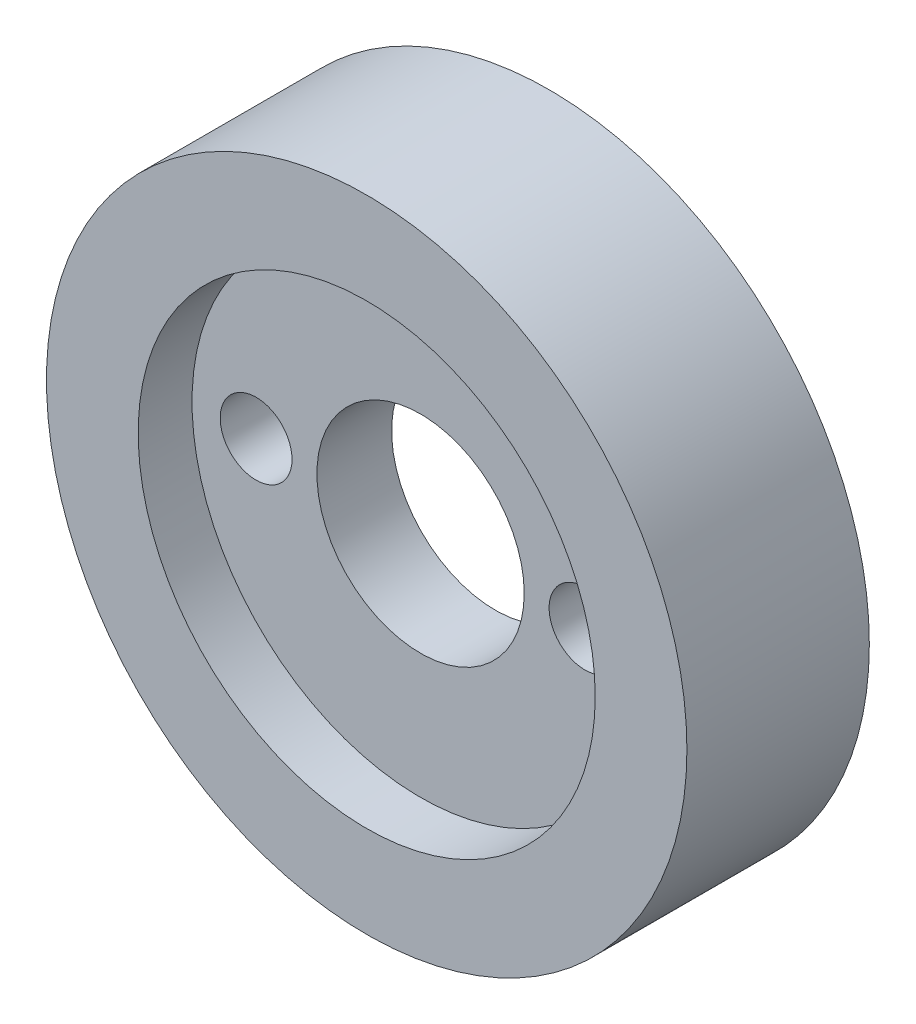
ISO-10303-21;
HEADER;
FILE_DESCRIPTION(('STEP AP214'),'2;1');
FILE_NAME('part.step','',(''),(''),'','','');
FILE_SCHEMA(('AUTOMOTIVE_DESIGN { 1 0 10303 214 1 1 1 1 }'));
ENDSEC;
DATA;
#1=APPLICATION_CONTEXT('core data for automotive mechanical design processes');
#2=APPLICATION_PROTOCOL_DEFINITION('international standard','automotive_design',2000,#1);
#3=PRODUCT_CONTEXT('',#1,'mechanical');
#4=PRODUCT('Part','Part','',(#3));
#5=PRODUCT_RELATED_PRODUCT_CATEGORY('part','',(#4));
#6=PRODUCT_DEFINITION_FORMATION('','',#4);
#7=PRODUCT_DEFINITION_CONTEXT('part definition',#1,'design');
#8=PRODUCT_DEFINITION('design','',#6,#7);
#9=PRODUCT_DEFINITION_SHAPE('','',#8);
#10=(LENGTH_UNIT() NAMED_UNIT(*) SI_UNIT(.MILLI.,.METRE.));
#11=(NAMED_UNIT(*) PLANE_ANGLE_UNIT() SI_UNIT($,.RADIAN.));
#12=(NAMED_UNIT(*) SI_UNIT($,.STERADIAN.) SOLID_ANGLE_UNIT());
#13=UNCERTAINTY_MEASURE_WITH_UNIT(LENGTH_MEASURE(1.E-05),#10,'distance_accuracy_value','');
#14=(GEOMETRIC_REPRESENTATION_CONTEXT(3) GLOBAL_UNCERTAINTY_ASSIGNED_CONTEXT((#13)) GLOBAL_UNIT_ASSIGNED_CONTEXT((#10,
#11,#12)) REPRESENTATION_CONTEXT('',''));
#15=CARTESIAN_POINT('',(0.,0.,0.));
#16=DIRECTION('',(0.,0.,1.));
#17=DIRECTION('',(1.,0.,0.));
#18=AXIS2_PLACEMENT_3D('',#15,#16,#17);
#19=CARTESIAN_POINT('',(0.,0.,2.794));
#20=DIRECTION('',(0.,0.,-1.));
#21=DIRECTION('',(-1.,0.,0.));
#22=AXIS2_PLACEMENT_3D('',#19,#20,#21);
#23=CYLINDRICAL_SURFACE('',#22,3.175);
#24=CARTESIAN_POINT('',(0.,0.,1.144));
#25=DIRECTION('',(0.,0.,1.));
#26=DIRECTION('',(1.,0.,0.));
#27=AXIS2_PLACEMENT_3D('',#24,#25,#26);
#28=CIRCLE('',#27,3.175);
#29=CARTESIAN_POINT('',(3.175,0.,1.144));
#30=VERTEX_POINT('',#29);
#31=EDGE_CURVE('E53',#30,#30,#28,.F.);
#32=ORIENTED_EDGE('',*,*,#31,.F.);
#33=EDGE_LOOP('',(#32));
#34=FACE_BOUND('',#33,.T.);
#35=CARTESIAN_POINT('',(0.,0.,-1.144));
#36=DIRECTION('',(0.,0.,1.));
#37=DIRECTION('',(1.,0.,0.));
#38=AXIS2_PLACEMENT_3D('',#35,#36,#37);
#39=CIRCLE('',#38,3.175);
#40=CARTESIAN_POINT('',(3.175,0.,-1.144));
#41=VERTEX_POINT('',#40);
#42=EDGE_CURVE('E62',#41,#41,#39,.F.);
#43=ORIENTED_EDGE('',*,*,#42,.T.);
#44=EDGE_LOOP('',(#43));
#45=FACE_BOUND('',#44,.T.);
#46=ADVANCED_FACE('F37',(#34,#45),#23,.F.);
#47=CARTESIAN_POINT('',(0.,0.,-2.794));
#48=DIRECTION('',(0.,0.,1.));
#49=DIRECTION('',(1.,0.,0.));
#50=AXIS2_PLACEMENT_3D('',#47,#48,#49);
#51=PLANE('',#50);
#52=CARTESIAN_POINT('',(0.,0.,-2.794));
#53=DIRECTION('',(0.,0.,1.));
#54=DIRECTION('',(1.,0.,0.));
#55=AXIS2_PLACEMENT_3D('',#52,#53,#54);
#56=CIRCLE('',#55,9.80909091);
#57=CARTESIAN_POINT('',(9.80909091,0.,-2.794));
#58=VERTEX_POINT('',#57);
#59=EDGE_CURVE('E41',#58,#58,#56,.T.);
#60=ORIENTED_EDGE('',*,*,#59,.F.);
#61=EDGE_LOOP('',(#60));
#62=FACE_BOUND('',#61,.T.);
#63=CARTESIAN_POINT('',(0.,0.,-2.794));
#64=DIRECTION('',(0.,0.,1.));
#65=DIRECTION('',(1.,0.,0.));
#66=AXIS2_PLACEMENT_3D('',#63,#64,#65);
#67=CIRCLE('',#66,7.);
#68=CARTESIAN_POINT('',(7.,0.,-2.794));
#69=VERTEX_POINT('',#68);
#70=EDGE_CURVE('E59',#69,#69,#67,.T.);
#71=ORIENTED_EDGE('',*,*,#70,.T.);
#72=EDGE_LOOP('',(#71));
#73=FACE_BOUND('',#72,.T.);
#74=ADVANCED_FACE('F98',(#62,#73),#51,.F.);
#75=CARTESIAN_POINT('',(0.,0.,2.794));
#76=DIRECTION('',(0.,0.,1.));
#77=DIRECTION('',(1.,0.,0.));
#78=AXIS2_PLACEMENT_3D('',#75,#76,#77);
#79=PLANE('',#78);
#80=CARTESIAN_POINT('',(0.,0.,2.794));
#81=DIRECTION('',(0.,0.,1.));
#82=DIRECTION('',(1.,0.,0.));
#83=AXIS2_PLACEMENT_3D('',#80,#81,#82);
#84=CIRCLE('',#83,9.80909091);
#85=CARTESIAN_POINT('',(9.80909091,0.,2.794));
#86=VERTEX_POINT('',#85);
#87=EDGE_CURVE('E10',#86,#86,#84,.T.);
#88=ORIENTED_EDGE('',*,*,#87,.T.);
#89=EDGE_LOOP('',(#88));
#90=FACE_BOUND('',#89,.T.);
#91=CARTESIAN_POINT('',(0.,0.,2.794));
#92=DIRECTION('',(0.,0.,1.));
#93=DIRECTION('',(1.,0.,0.));
#94=AXIS2_PLACEMENT_3D('',#91,#92,#93);
#95=CIRCLE('',#94,7.);
#96=CARTESIAN_POINT('',(7.,0.,2.794));
#97=VERTEX_POINT('',#96);
#98=EDGE_CURVE('E50',#97,#97,#95,.T.);
#99=ORIENTED_EDGE('',*,*,#98,.F.);
#100=EDGE_LOOP('',(#99));
#101=FACE_BOUND('',#100,.T.);
#102=ADVANCED_FACE('F105',(#90,#101),#79,.T.);
#103=CARTESIAN_POINT('',(0.,0.,2.794));
#104=DIRECTION('',(0.,0.,-1.));
#105=DIRECTION('',(-1.,0.,0.));
#106=AXIS2_PLACEMENT_3D('',#103,#104,#105);
#107=CYLINDRICAL_SURFACE('',#106,9.80909091);
#108=ORIENTED_EDGE('',*,*,#87,.F.);
#109=EDGE_LOOP('',(#108));
#110=FACE_BOUND('',#109,.T.);
#111=ORIENTED_EDGE('',*,*,#59,.T.);
#112=EDGE_LOOP('',(#111));
#113=FACE_BOUND('',#112,.T.);
#114=ADVANCED_FACE('F39',(#110,#113),#107,.T.);
#115=CARTESIAN_POINT('',(0.,0.,1.144));
#116=DIRECTION('',(0.,0.,1.));
#117=DIRECTION('',(1.,0.,0.));
#118=AXIS2_PLACEMENT_3D('',#115,#116,#117);
#119=CYLINDRICAL_SURFACE('',#118,7.);
#120=CARTESIAN_POINT('',(0.,0.,1.144));
#121=DIRECTION('',(0.,0.,1.));
#122=DIRECTION('',(1.,0.,0.));
#123=AXIS2_PLACEMENT_3D('',#120,#121,#122);
#124=CIRCLE('',#123,7.);
#125=CARTESIAN_POINT('',(7.,0.,1.144));
#126=VERTEX_POINT('',#125);
#127=EDGE_CURVE('E48',#126,#126,#124,.T.);
#128=ORIENTED_EDGE('',*,*,#127,.F.);
#129=EDGE_LOOP('',(#128));
#130=FACE_BOUND('',#129,.T.);
#131=ORIENTED_EDGE('',*,*,#98,.T.);
#132=EDGE_LOOP('',(#131));
#133=FACE_BOUND('',#132,.T.);
#134=ADVANCED_FACE('F111',(#130,#133),#119,.F.);
#135=CARTESIAN_POINT('',(0.,0.,1.144));
#136=DIRECTION('',(0.,0.,1.));
#137=DIRECTION('',(1.,0.,0.));
#138=AXIS2_PLACEMENT_3D('',#135,#136,#137);
#139=PLANE('',#138);
#140=ORIENTED_EDGE('',*,*,#31,.T.);
#141=EDGE_LOOP('',(#140));
#142=FACE_BOUND('',#141,.T.);
#143=CARTESIAN_POINT('',(-5.0375,0.,1.144));
#144=DIRECTION('',(0.,0.,1.));
#145=DIRECTION('',(1.,0.,0.));
#146=AXIS2_PLACEMENT_3D('',#143,#144,#145);
#147=CIRCLE('',#146,1.1);
#148=CARTESIAN_POINT('',(-3.9375,0.,1.144));
#149=VERTEX_POINT('',#148);
#150=EDGE_CURVE('E63',#149,#149,#147,.T.);
#151=ORIENTED_EDGE('',*,*,#150,.F.);
#152=EDGE_LOOP('',(#151));
#153=FACE_BOUND('',#152,.T.);
#154=ORIENTED_EDGE('',*,*,#127,.T.);
#155=EDGE_LOOP('',(#154));
#156=FACE_BOUND('',#155,.T.);
#157=CARTESIAN_POINT('',(5.0375,0.,1.144));
#158=DIRECTION('',(0.,0.,1.));
#159=DIRECTION('',(1.,0.,0.));
#160=AXIS2_PLACEMENT_3D('',#157,#158,#159);
#161=CIRCLE('',#160,1.1);
#162=CARTESIAN_POINT('',(6.1375,0.,1.144));
#163=VERTEX_POINT('',#162);
#164=EDGE_CURVE('E73',#163,#163,#161,.F.);
#165=ORIENTED_EDGE('',*,*,#164,.T.);
#166=EDGE_LOOP('',(#165));
#167=FACE_BOUND('',#166,.T.);
#168=ADVANCED_FACE('F122',(#142,#153,#156,#167),#139,.T.);
#169=CARTESIAN_POINT('',(0.,0.,-1.144));
#170=DIRECTION('',(0.,0.,-1.));
#171=DIRECTION('',(-1.,0.,0.));
#172=AXIS2_PLACEMENT_3D('',#169,#170,#171);
#173=CYLINDRICAL_SURFACE('',#172,7.);
#174=CARTESIAN_POINT('',(0.,0.,-1.144));
#175=DIRECTION('',(0.,0.,1.));
#176=DIRECTION('',(1.,0.,0.));
#177=AXIS2_PLACEMENT_3D('',#174,#175,#176);
#178=CIRCLE('',#177,7.);
#179=CARTESIAN_POINT('',(7.,0.,-1.144));
#180=VERTEX_POINT('',#179);
#181=EDGE_CURVE('E54',#180,#180,#178,.T.);
#182=ORIENTED_EDGE('',*,*,#181,.T.);
#183=EDGE_LOOP('',(#182));
#184=FACE_BOUND('',#183,.T.);
#185=ORIENTED_EDGE('',*,*,#70,.F.);
#186=EDGE_LOOP('',(#185));
#187=FACE_BOUND('',#186,.T.);
#188=ADVANCED_FACE('F93',(#184,#187),#173,.F.);
#189=CARTESIAN_POINT('',(0.,0.,-1.144));
#190=DIRECTION('',(0.,0.,-1.));
#191=DIRECTION('',(1.,0.,0.));
#192=AXIS2_PLACEMENT_3D('',#189,#190,#191);
#193=PLANE('',#192);
#194=ORIENTED_EDGE('',*,*,#42,.F.);
#195=EDGE_LOOP('',(#194));
#196=FACE_BOUND('',#195,.T.);
#197=CARTESIAN_POINT('',(-5.0375,0.,-1.144));
#198=DIRECTION('',(0.,0.,-1.));
#199=DIRECTION('',(-1.,0.,0.));
#200=AXIS2_PLACEMENT_3D('',#197,#198,#199);
#201=CIRCLE('',#200,1.1);
#202=CARTESIAN_POINT('',(-6.1375,0.,-1.144));
#203=VERTEX_POINT('',#202);
#204=EDGE_CURVE('E70',#203,#203,#201,.T.);
#205=ORIENTED_EDGE('',*,*,#204,.F.);
#206=EDGE_LOOP('',(#205));
#207=FACE_BOUND('',#206,.T.);
#208=ORIENTED_EDGE('',*,*,#181,.F.);
#209=EDGE_LOOP('',(#208));
#210=FACE_BOUND('',#209,.T.);
#211=CARTESIAN_POINT('',(5.0375,0.,-1.144));
#212=DIRECTION('',(0.,0.,-1.));
#213=DIRECTION('',(-1.,0.,0.));
#214=AXIS2_PLACEMENT_3D('',#211,#212,#213);
#215=CIRCLE('',#214,1.1);
#216=CARTESIAN_POINT('',(3.9375,0.,-1.144));
#217=VERTEX_POINT('',#216);
#218=EDGE_CURVE('E76',#217,#217,#215,.F.);
#219=ORIENTED_EDGE('',*,*,#218,.T.);
#220=EDGE_LOOP('',(#219));
#221=FACE_BOUND('',#220,.T.);
#222=ADVANCED_FACE('F80',(#196,#207,#210,#221),#193,.T.);
#223=CARTESIAN_POINT('',(5.0375,0.,-2.794));
#224=DIRECTION('',(0.,0.,1.));
#225=DIRECTION('',(1.,0.,0.));
#226=AXIS2_PLACEMENT_3D('',#223,#224,#225);
#227=CYLINDRICAL_SURFACE('',#226,1.1);
#228=ORIENTED_EDGE('',*,*,#164,.F.);
#229=EDGE_LOOP('',(#228));
#230=FACE_BOUND('',#229,.T.);
#231=ORIENTED_EDGE('',*,*,#218,.F.);
#232=EDGE_LOOP('',(#231));
#233=FACE_BOUND('',#232,.T.);
#234=ADVANCED_FACE('F82',(#230,#233),#227,.F.);
#235=CARTESIAN_POINT('',(-5.0375,0.,-2.794));
#236=DIRECTION('',(0.,0.,1.));
#237=DIRECTION('',(1.,0.,0.));
#238=AXIS2_PLACEMENT_3D('',#235,#236,#237);
#239=CYLINDRICAL_SURFACE('',#238,1.1);
#240=ORIENTED_EDGE('',*,*,#150,.T.);
#241=EDGE_LOOP('',(#240));
#242=FACE_BOUND('',#241,.T.);
#243=ORIENTED_EDGE('',*,*,#204,.T.);
#244=EDGE_LOOP('',(#243));
#245=FACE_BOUND('',#244,.T.);
#246=ADVANCED_FACE('F84',(#242,#245),#239,.F.);
#247=CLOSED_SHELL('',(#46,#74,#102,#114,#134,#168,#188,#222,#234,#246));
#248=MANIFOLD_SOLID_BREP('B2',#247);
#249=ADVANCED_BREP_SHAPE_REPRESENTATION('',(#18,#248),#14);
#250=SHAPE_DEFINITION_REPRESENTATION(#9,#249);
ENDSEC;
END-ISO-10303-21;
